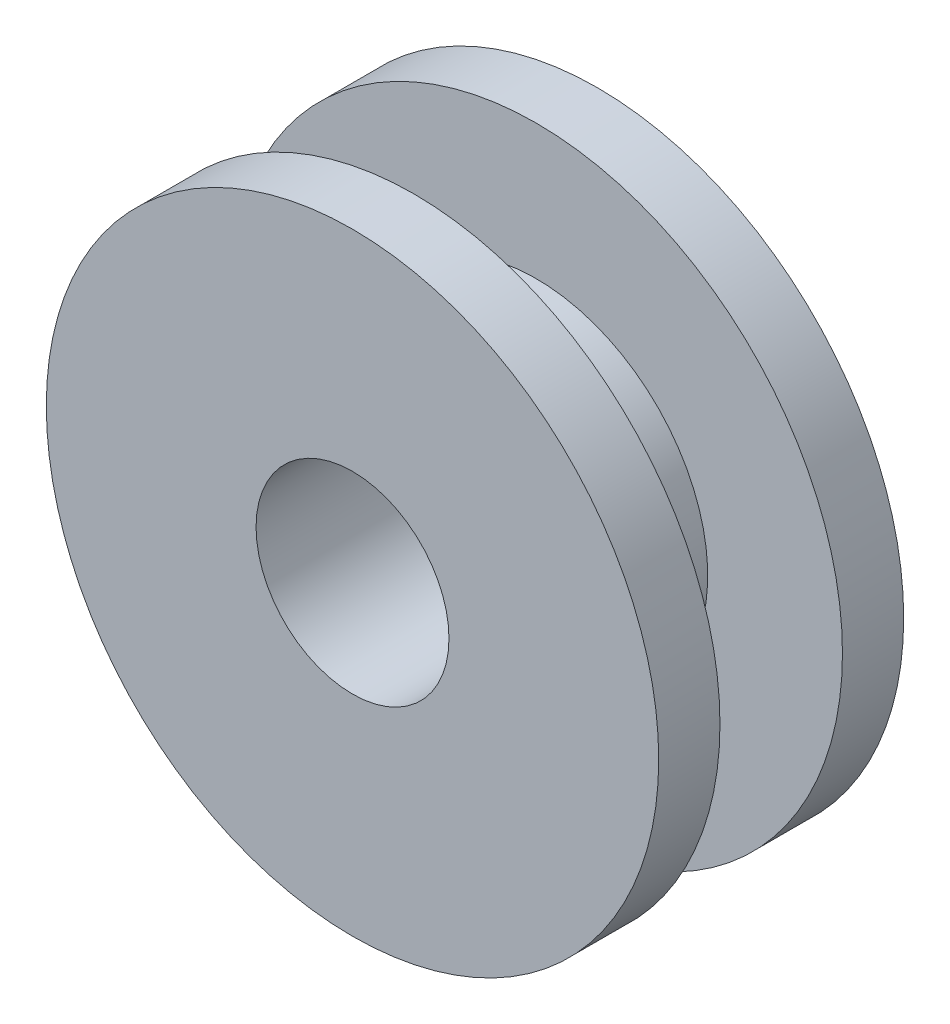
ISO-10303-21;
HEADER;
FILE_DESCRIPTION(('STEP AP214'),'2;1');
FILE_NAME('part.step','',(''),(''),'','','');
FILE_SCHEMA(('AUTOMOTIVE_DESIGN { 1 0 10303 214 1 1 1 1 }'));
ENDSEC;
DATA;
#1=APPLICATION_CONTEXT('core data for automotive mechanical design processes');
#2=APPLICATION_PROTOCOL_DEFINITION('international standard','automotive_design',2000,#1);
#3=PRODUCT_CONTEXT('',#1,'mechanical');
#4=PRODUCT('Part','Part','',(#3));
#5=PRODUCT_RELATED_PRODUCT_CATEGORY('part','',(#4));
#6=PRODUCT_DEFINITION_FORMATION('','',#4);
#7=PRODUCT_DEFINITION_CONTEXT('part definition',#1,'design');
#8=PRODUCT_DEFINITION('design','',#6,#7);
#9=PRODUCT_DEFINITION_SHAPE('','',#8);
#10=(LENGTH_UNIT() NAMED_UNIT(*) SI_UNIT(.MILLI.,.METRE.));
#11=(NAMED_UNIT(*) PLANE_ANGLE_UNIT() SI_UNIT($,.RADIAN.));
#12=(NAMED_UNIT(*) SI_UNIT($,.STERADIAN.) SOLID_ANGLE_UNIT());
#13=UNCERTAINTY_MEASURE_WITH_UNIT(LENGTH_MEASURE(1.E-05),#10,'distance_accuracy_value','');
#14=(GEOMETRIC_REPRESENTATION_CONTEXT(3) GLOBAL_UNCERTAINTY_ASSIGNED_CONTEXT((#13)) GLOBAL_UNIT_ASSIGNED_CONTEXT((#10,
#11,#12)) REPRESENTATION_CONTEXT('',''));
#15=CARTESIAN_POINT('',(0.,0.,0.));
#16=DIRECTION('',(0.,0.,1.));
#17=DIRECTION('',(1.,0.,0.));
#18=AXIS2_PLACEMENT_3D('',#15,#16,#17);
#19=CARTESIAN_POINT('',(0.,0.,-2.));
#20=DIRECTION('',(0.,0.,-1.));
#21=DIRECTION('',(-1.,0.,0.));
#22=AXIS2_PLACEMENT_3D('',#19,#20,#21);
#23=PLANE('',#22);
#24=CARTESIAN_POINT('',(0.,0.,-2.));
#25=DIRECTION('',(0.,0.,-1.));
#26=DIRECTION('',(-1.,0.,0.));
#27=AXIS2_PLACEMENT_3D('',#24,#25,#26);
#28=CIRCLE('',#27,5.6);
#29=CARTESIAN_POINT('',(-5.6,0.,-2.));
#30=VERTEX_POINT('',#29);
#31=EDGE_CURVE('E10',#30,#30,#28,.T.);
#32=ORIENTED_EDGE('',*,*,#31,.F.);
#33=EDGE_LOOP('',(#32));
#34=FACE_BOUND('',#33,.T.);
#35=CARTESIAN_POINT('',(0.,0.,-2.));
#36=DIRECTION('',(0.,0.,-1.));
#37=DIRECTION('',(-1.,0.,0.));
#38=AXIS2_PLACEMENT_3D('',#35,#36,#37);
#39=CIRCLE('',#38,10.);
#40=CARTESIAN_POINT('',(-10.,0.,-2.));
#41=VERTEX_POINT('',#40);
#42=EDGE_CURVE('E40',#41,#41,#39,.T.);
#43=ORIENTED_EDGE('',*,*,#42,.T.);
#44=EDGE_LOOP('',(#43));
#45=FACE_BOUND('',#44,.T.);
#46=ADVANCED_FACE('F32',(#34,#45),#23,.T.);
#47=CARTESIAN_POINT('',(0.,0.,-2.));
#48=DIRECTION('',(0.,0.,1.));
#49=DIRECTION('',(1.,0.,0.));
#50=AXIS2_PLACEMENT_3D('',#47,#48,#49);
#51=CYLINDRICAL_SURFACE('',#50,10.);
#52=ORIENTED_EDGE('',*,*,#42,.F.);
#53=EDGE_LOOP('',(#52));
#54=FACE_BOUND('',#53,.T.);
#55=CARTESIAN_POINT('',(0.,0.,0.));
#56=DIRECTION('',(0.,0.,-1.));
#57=DIRECTION('',(-1.,0.,0.));
#58=AXIS2_PLACEMENT_3D('',#55,#56,#57);
#59=CIRCLE('',#58,10.);
#60=CARTESIAN_POINT('',(-10.,0.,0.));
#61=VERTEX_POINT('',#60);
#62=EDGE_CURVE('E36',#61,#61,#59,.T.);
#63=ORIENTED_EDGE('',*,*,#62,.T.);
#64=EDGE_LOOP('',(#63));
#65=FACE_BOUND('',#64,.T.);
#66=ADVANCED_FACE('F34',(#54,#65),#51,.T.);
#67=CARTESIAN_POINT('',(0.,0.,0.));
#68=DIRECTION('',(0.,0.,-1.));
#69=DIRECTION('',(-1.,0.,0.));
#70=AXIS2_PLACEMENT_3D('',#67,#68,#69);
#71=PLANE('',#70);
#72=CARTESIAN_POINT('',(0.,0.,0.));
#73=DIRECTION('',(0.,0.,1.));
#74=DIRECTION('',(1.,0.,0.));
#75=AXIS2_PLACEMENT_3D('',#72,#73,#74);
#76=CIRCLE('',#75,3.15);
#77=CARTESIAN_POINT('',(3.15,0.,0.));
#78=VERTEX_POINT('',#77);
#79=EDGE_CURVE('E56',#78,#78,#76,.T.);
#80=ORIENTED_EDGE('',*,*,#79,.F.);
#81=EDGE_LOOP('',(#80));
#82=FACE_BOUND('',#81,.T.);
#83=ORIENTED_EDGE('',*,*,#62,.F.);
#84=EDGE_LOOP('',(#83));
#85=FACE_BOUND('',#84,.T.);
#86=ADVANCED_FACE('F72',(#82,#85),#71,.F.);
#87=CARTESIAN_POINT('',(0.,0.,-6.));
#88=DIRECTION('',(0.,0.,1.));
#89=DIRECTION('',(1.,0.,0.));
#90=AXIS2_PLACEMENT_3D('',#87,#88,#89);
#91=CYLINDRICAL_SURFACE('',#90,5.6);
#92=CARTESIAN_POINT('',(0.,0.,-6.));
#93=DIRECTION('',(0.,0.,-1.));
#94=DIRECTION('',(-1.,0.,0.));
#95=AXIS2_PLACEMENT_3D('',#92,#93,#94);
#96=CIRCLE('',#95,5.6);
#97=CARTESIAN_POINT('',(-5.6,0.,-6.));
#98=VERTEX_POINT('',#97);
#99=EDGE_CURVE('E46',#98,#98,#96,.T.);
#100=ORIENTED_EDGE('',*,*,#99,.F.);
#101=EDGE_LOOP('',(#100));
#102=FACE_BOUND('',#101,.T.);
#103=ORIENTED_EDGE('',*,*,#31,.T.);
#104=EDGE_LOOP('',(#103));
#105=FACE_BOUND('',#104,.T.);
#106=ADVANCED_FACE('F75',(#102,#105),#91,.T.);
#107=CARTESIAN_POINT('',(0.,0.,-8.));
#108=DIRECTION('',(0.,0.,1.));
#109=DIRECTION('',(1.,0.,0.));
#110=AXIS2_PLACEMENT_3D('',#107,#108,#109);
#111=CYLINDRICAL_SURFACE('',#110,10.);
#112=CARTESIAN_POINT('',(0.,0.,-8.));
#113=DIRECTION('',(0.,0.,-1.));
#114=DIRECTION('',(-1.,0.,0.));
#115=AXIS2_PLACEMENT_3D('',#112,#113,#114);
#116=CIRCLE('',#115,10.);
#117=CARTESIAN_POINT('',(-10.,0.,-8.));
#118=VERTEX_POINT('',#117);
#119=EDGE_CURVE('E49',#118,#118,#116,.T.);
#120=ORIENTED_EDGE('',*,*,#119,.F.);
#121=EDGE_LOOP('',(#120));
#122=FACE_BOUND('',#121,.T.);
#123=CARTESIAN_POINT('',(0.,0.,-6.));
#124=DIRECTION('',(0.,0.,-1.));
#125=DIRECTION('',(-1.,0.,0.));
#126=AXIS2_PLACEMENT_3D('',#123,#124,#125);
#127=CIRCLE('',#126,10.);
#128=CARTESIAN_POINT('',(-10.,0.,-6.));
#129=VERTEX_POINT('',#128);
#130=EDGE_CURVE('E50',#129,#129,#127,.T.);
#131=ORIENTED_EDGE('',*,*,#130,.T.);
#132=EDGE_LOOP('',(#131));
#133=FACE_BOUND('',#132,.T.);
#134=ADVANCED_FACE('F93',(#122,#133),#111,.T.);
#135=CARTESIAN_POINT('',(0.,0.,-8.));
#136=DIRECTION('',(0.,0.,-1.));
#137=DIRECTION('',(-1.,0.,0.));
#138=AXIS2_PLACEMENT_3D('',#135,#136,#137);
#139=PLANE('',#138);
#140=CARTESIAN_POINT('',(0.,0.,-8.));
#141=DIRECTION('',(0.,0.,1.));
#142=DIRECTION('',(1.,0.,0.));
#143=AXIS2_PLACEMENT_3D('',#140,#141,#142);
#144=CIRCLE('',#143,3.15);
#145=CARTESIAN_POINT('',(3.15,0.,-8.));
#146=VERTEX_POINT('',#145);
#147=EDGE_CURVE('E53',#146,#146,#144,.T.);
#148=ORIENTED_EDGE('',*,*,#147,.T.);
#149=EDGE_LOOP('',(#148));
#150=FACE_BOUND('',#149,.T.);
#151=ORIENTED_EDGE('',*,*,#119,.T.);
#152=EDGE_LOOP('',(#151));
#153=FACE_BOUND('',#152,.T.);
#154=ADVANCED_FACE('F62',(#150,#153),#139,.T.);
#155=CARTESIAN_POINT('',(0.,0.,-6.));
#156=DIRECTION('',(0.,0.,-1.));
#157=DIRECTION('',(-1.,0.,0.));
#158=AXIS2_PLACEMENT_3D('',#155,#156,#157);
#159=PLANE('',#158);
#160=ORIENTED_EDGE('',*,*,#99,.T.);
#161=EDGE_LOOP('',(#160));
#162=FACE_BOUND('',#161,.T.);
#163=ORIENTED_EDGE('',*,*,#130,.F.);
#164=EDGE_LOOP('',(#163));
#165=FACE_BOUND('',#164,.T.);
#166=ADVANCED_FACE('F68',(#162,#165),#159,.F.);
#167=CARTESIAN_POINT('',(0.,0.,-8.));
#168=DIRECTION('',(0.,0.,1.));
#169=DIRECTION('',(1.,0.,0.));
#170=AXIS2_PLACEMENT_3D('',#167,#168,#169);
#171=CYLINDRICAL_SURFACE('',#170,3.15);
#172=ORIENTED_EDGE('',*,*,#147,.F.);
#173=EDGE_LOOP('',(#172));
#174=FACE_BOUND('',#173,.T.);
#175=ORIENTED_EDGE('',*,*,#79,.T.);
#176=EDGE_LOOP('',(#175));
#177=FACE_BOUND('',#176,.T.);
#178=ADVANCED_FACE('F65',(#174,#177),#171,.F.);
#179=CLOSED_SHELL('',(#46,#66,#86,#106,#134,#154,#166,#178));
#180=MANIFOLD_SOLID_BREP('B2',#179);
#181=ADVANCED_BREP_SHAPE_REPRESENTATION('',(#18,#180),#14);
#182=SHAPE_DEFINITION_REPRESENTATION(#9,#181);
ENDSEC;
END-ISO-10303-21;
